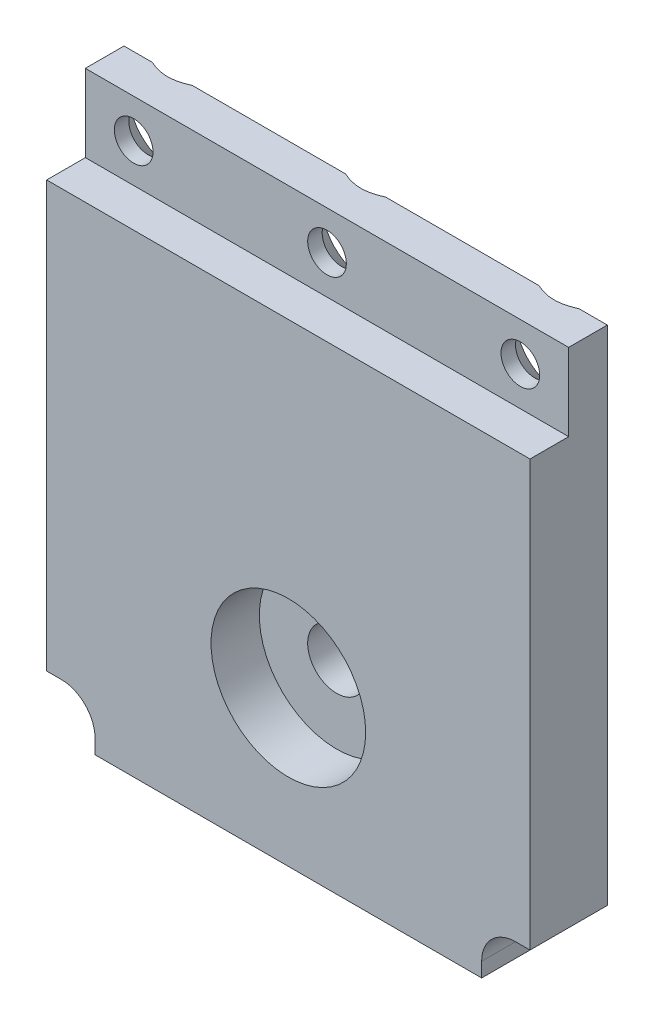
ISO-10303-21;
HEADER;
FILE_DESCRIPTION(('STEP AP214'),'2;1');
FILE_NAME('part.step','',(''),(''),'','','');
FILE_SCHEMA(('AUTOMOTIVE_DESIGN { 1 0 10303 214 1 1 1 1 }'));
ENDSEC;
DATA;
#1=APPLICATION_CONTEXT('core data for automotive mechanical design processes');
#2=APPLICATION_PROTOCOL_DEFINITION('international standard','automotive_design',2000,#1);
#3=PRODUCT_CONTEXT('',#1,'mechanical');
#4=PRODUCT('Part','Part','',(#3));
#5=PRODUCT_RELATED_PRODUCT_CATEGORY('part','',(#4));
#6=PRODUCT_DEFINITION_FORMATION('','',#4);
#7=PRODUCT_DEFINITION_CONTEXT('part definition',#1,'design');
#8=PRODUCT_DEFINITION('design','',#6,#7);
#9=PRODUCT_DEFINITION_SHAPE('','',#8);
#10=(LENGTH_UNIT() NAMED_UNIT(*) SI_UNIT(.MILLI.,.METRE.));
#11=(NAMED_UNIT(*) PLANE_ANGLE_UNIT() SI_UNIT($,.RADIAN.));
#12=(NAMED_UNIT(*) SI_UNIT($,.STERADIAN.) SOLID_ANGLE_UNIT());
#13=UNCERTAINTY_MEASURE_WITH_UNIT(LENGTH_MEASURE(1.E-05),#10,'distance_accuracy_value','');
#14=(GEOMETRIC_REPRESENTATION_CONTEXT(3) GLOBAL_UNCERTAINTY_ASSIGNED_CONTEXT((#13)) GLOBAL_UNIT_ASSIGNED_CONTEXT((#10,
#11,#12)) REPRESENTATION_CONTEXT('',''));
#15=CARTESIAN_POINT('',(0.,0.,0.));
#16=DIRECTION('',(0.,0.,1.));
#17=DIRECTION('',(1.,0.,0.));
#18=AXIS2_PLACEMENT_3D('',#15,#16,#17);
#19=CARTESIAN_POINT('',(-25.,28.5,8.));
#20=DIRECTION('',(0.,-1.,0.));
#21=DIRECTION('',(1.,0.,0.));
#22=AXIS2_PLACEMENT_3D('',#19,#20,#21);
#23=PLANE('',#22);
#24=DIRECTION('',(-1.,0.,0.));
#25=VECTOR('',#24,1.);
#26=CARTESIAN_POINT('',(-25.,28.5,4.));
#27=LINE('',#26,#25);
#28=CARTESIAN_POINT('',(25.,28.5,4.));
#29=VERTEX_POINT('',#28);
#30=CARTESIAN_POINT('',(-25.,28.5,4.));
#31=VERTEX_POINT('',#30);
#32=EDGE_CURVE('E158',#29,#31,#27,.T.);
#33=ORIENTED_EDGE('',*,*,#32,.F.);
#34=DIRECTION('',(0.,0.,-1.));
#35=VECTOR('',#34,1.);
#36=CARTESIAN_POINT('',(25.,28.5,8.));
#37=LINE('',#36,#35);
#38=CARTESIAN_POINT('',(25.,28.5,0.));
#39=VERTEX_POINT('',#38);
#40=EDGE_CURVE('E242',#29,#39,#37,.T.);
#41=ORIENTED_EDGE('',*,*,#40,.T.);
#42=DIRECTION('',(-1.,0.,0.));
#43=VECTOR('',#42,1.);
#44=CARTESIAN_POINT('',(-25.,28.5,0.));
#45=LINE('',#44,#43);
#46=CARTESIAN_POINT('',(22.0615528128088,28.5,0.));
#47=VERTEX_POINT('',#46);
#48=EDGE_CURVE('E206',#39,#47,#45,.T.);
#49=ORIENTED_EDGE('',*,*,#48,.T.);
#50=CARTESIAN_POINT('',(22.0615528128088,28.5,0.));
#51=CARTESIAN_POINT('',(21.9163115076665,28.5,0.0665140046887301));
#52=CARTESIAN_POINT('',(21.7687872339746,28.5,0.128569718966713));
#53=CARTESIAN_POINT('',(21.4687365346781,28.5,0.241160332854404));
#54=CARTESIAN_POINT('',(21.3161917571449,28.5,0.291645925575715));
#55=CARTESIAN_POINT('',(21.0088769190301,28.5,0.377331377129475));
#56=CARTESIAN_POINT('',(20.8541609144906,28.5,0.412719940976492));
#57=CARTESIAN_POINT('',(20.5419867211631,28.5,0.466367057856301));
#58=CARTESIAN_POINT('',(20.3845337208675,28.5,0.484655043680468));
#59=CARTESIAN_POINT('',(20.0809432550529,28.5,0.501824046995297));
#60=CARTESIAN_POINT('',(19.9348859756068,28.5,0.502113580668128));
#61=CARTESIAN_POINT('',(19.6435468990572,28.5,0.486786692782426));
#62=CARTESIAN_POINT('',(19.4982655528719,28.5,0.471161860054131));
#63=CARTESIAN_POINT('',(19.2100936986599,28.5,0.425237963374039));
#64=CARTESIAN_POINT('',(19.067203240881,28.5,0.394938591416323));
#65=CARTESIAN_POINT('',(18.7846957776989,28.5,0.321684210682046));
#66=CARTESIAN_POINT('',(18.6450801209539,28.5,0.278724083308546));
#67=CARTESIAN_POINT('',(18.410526573718,28.5,0.196723660111647));
#68=CARTESIAN_POINT('',(18.3146468065157,28.5,0.16031545116514));
#69=CARTESIAN_POINT('',(18.1250409435993,28.5,0.0832113414498181));
#70=CARTESIAN_POINT('',(18.0313081138786,28.5,0.042532050748546));
#71=CARTESIAN_POINT('',(17.9384471871911,28.5,0.));
#72=B_SPLINE_CURVE_WITH_KNOTS('',3,(#50,#51,#52,#53,#54,#55,#56,#57,#58,#59,#60,#61,#62,#63,#64,
#65,#66,#67,#68,#69,#70,#71),.UNSPECIFIED.,.F.,.F.,(4,2,2,2,2,2,2,2,2,2,4),(0.,
0.479497727555005,0.961002368999467,1.43629834305226,1.91077474381833,2.34806888838962,
2.78559427464543,3.2231288445797,3.66084054790949,3.968414012628,4.27483277985521),.UNSPECIFIED.);
#73=CARTESIAN_POINT('',(17.9384471871912,28.5,0.));
#74=VERTEX_POINT('',#73);
#75=EDGE_CURVE('E272',#47,#74,#72,.T.);
#76=ORIENTED_EDGE('',*,*,#75,.T.);
#77=CARTESIAN_POINT('',(2.06155281280885,28.5,0.));
#78=VERTEX_POINT('',#77);
#79=EDGE_CURVE('E240',#74,#78,#45,.T.);
#80=ORIENTED_EDGE('',*,*,#79,.T.);
#81=CARTESIAN_POINT('',(2.06155281280885,28.5,0.));
#82=CARTESIAN_POINT('',(1.91631150766653,28.5,0.0665140046887301));
#83=CARTESIAN_POINT('',(1.7687872339746,28.5,0.128569718966714));
#84=CARTESIAN_POINT('',(1.46873653467814,28.5,0.241160332854406));
#85=CARTESIAN_POINT('',(1.31619175714491,28.5,0.291645925575718));
#86=CARTESIAN_POINT('',(1.00887691903006,28.5,0.377331377129478));
#87=CARTESIAN_POINT('',(0.85416091449057,28.5,0.412719940976494));
#88=CARTESIAN_POINT('',(0.541986721163106,28.5,0.466367057856304));
#89=CARTESIAN_POINT('',(0.38453372086754,28.5,0.484655043680471));
#90=CARTESIAN_POINT('',(0.0809432550529437,28.5,0.501824046995299));
#91=CARTESIAN_POINT('',(-0.0651140243932302,28.5,0.50211358066813));
#92=CARTESIAN_POINT('',(-0.356453100942829,28.5,0.486786692782427));
#93=CARTESIAN_POINT('',(-0.501734447128126,28.5,0.471161860054132));
#94=CARTESIAN_POINT('',(-0.789906301340141,28.5,0.425237963374039));
#95=CARTESIAN_POINT('',(-0.932796759119046,28.5,0.394938591416322));
#96=CARTESIAN_POINT('',(-1.21530422230115,28.5,0.321684210682045));
#97=CARTESIAN_POINT('',(-1.35491987904607,28.5,0.278724083308545));
#98=CARTESIAN_POINT('',(-1.58947342628203,28.5,0.196723660111647));
#99=CARTESIAN_POINT('',(-1.68535319348432,28.5,0.160315451165141));
#100=CARTESIAN_POINT('',(-1.87495905640074,28.5,0.0832113414498207));
#101=CARTESIAN_POINT('',(-1.96869188612143,28.5,0.0425320507485486));
#102=CARTESIAN_POINT('',(-2.06155281280885,28.5,0.));
#103=B_SPLINE_CURVE_WITH_KNOTS('',3,(#81,#82,#83,#84,#85,#86,#87,#88,#89,#90,#91,#92,#93,#94,
#95,#96,#97,#98,#99,#100,#101,#102),.UNSPECIFIED.,.F.,.F.,(4,2,2,2,2,2,2,2,2,2,4),(0.,
0.479497727555007,0.961002368999472,1.43629834305227,1.91077474381835,2.34806888838963,
2.78559427464544,3.22312884457971,3.66084054790951,3.96841401262801,4.27483277985521),.UNSPECIFIED.);
#104=CARTESIAN_POINT('',(-2.06155281280885,28.5,0.));
#105=VERTEX_POINT('',#104);
#106=EDGE_CURVE('E292',#78,#105,#103,.T.);
#107=ORIENTED_EDGE('',*,*,#106,.T.);
#108=CARTESIAN_POINT('',(-17.9384471871911,28.5,0.));
#109=VERTEX_POINT('',#108);
#110=EDGE_CURVE('E378',#105,#109,#45,.T.);
#111=ORIENTED_EDGE('',*,*,#110,.T.);
#112=CARTESIAN_POINT('',(-17.9384471871911,28.5,0.));
#113=CARTESIAN_POINT('',(-18.0836884923335,28.5,0.0665140046887315));
#114=CARTESIAN_POINT('',(-18.2312127660254,28.5,0.128569718966716));
#115=CARTESIAN_POINT('',(-18.5312634653218,28.5,0.241160332854409));
#116=CARTESIAN_POINT('',(-18.6838082428551,28.5,0.291645925575721));
#117=CARTESIAN_POINT('',(-18.9911230809699,28.5,0.377331377129481));
#118=CARTESIAN_POINT('',(-19.1458390855094,28.5,0.412719940976498));
#119=CARTESIAN_POINT('',(-19.4580132788369,28.5,0.46636705785631));
#120=CARTESIAN_POINT('',(-19.6154662791325,28.5,0.484655043680477));
#121=CARTESIAN_POINT('',(-19.919056744947,28.5,0.501824046995306));
#122=CARTESIAN_POINT('',(-20.0651140243932,28.5,0.502113580668137));
#123=CARTESIAN_POINT('',(-20.3564531009428,28.5,0.486786692782435));
#124=CARTESIAN_POINT('',(-20.5017344471281,28.5,0.47116186005414));
#125=CARTESIAN_POINT('',(-20.7899063013401,28.5,0.425237963374048));
#126=CARTESIAN_POINT('',(-20.932796759119,28.5,0.394938591416331));
#127=CARTESIAN_POINT('',(-21.2153042223011,28.5,0.321684210682054));
#128=CARTESIAN_POINT('',(-21.3549198790461,28.5,0.278724083308555));
#129=CARTESIAN_POINT('',(-21.589473426282,28.5,0.196723660111654));
#130=CARTESIAN_POINT('',(-21.6853531934843,28.5,0.160315451165146));
#131=CARTESIAN_POINT('',(-21.8749590564008,28.5,0.0832113414498218));
#132=CARTESIAN_POINT('',(-21.9686918861214,28.5,0.0425320507485483));
#133=CARTESIAN_POINT('',(-22.0615528128089,28.5,0.));
#134=B_SPLINE_CURVE_WITH_KNOTS('',3,(#112,#113,#114,#115,#116,#117,#118,#119,#120,#121,#122,
#123,#124,#125,#126,#127,#128,#129,#130,#131,#132,#133),.UNSPECIFIED.,.F.,.F.,(4,2,2,2,2,2,2,2,
2,2,4),(0.,0.479497727555006,0.961002368999476,1.43629834305227,1.91077474381835,
2.34806888838963,2.78559427464545,3.22312884457971,3.66084054790951,3.96841401262803,
4.27483277985524),.UNSPECIFIED.);
#135=CARTESIAN_POINT('',(-22.0615528128089,28.5,0.));
#136=VERTEX_POINT('',#135);
#137=EDGE_CURVE('E265',#109,#136,#134,.T.);
#138=ORIENTED_EDGE('',*,*,#137,.T.);
#139=CARTESIAN_POINT('',(-25.,28.5,0.));
#140=VERTEX_POINT('',#139);
#141=EDGE_CURVE('E237',#136,#140,#45,.T.);
#142=ORIENTED_EDGE('',*,*,#141,.T.);
#143=DIRECTION('',(0.,0.,-1.));
#144=VECTOR('',#143,1.);
#145=CARTESIAN_POINT('',(-25.,28.5,8.));
#146=LINE('',#145,#144);
#147=EDGE_CURVE('E220',#31,#140,#146,.T.);
#148=ORIENTED_EDGE('',*,*,#147,.F.);
#149=EDGE_LOOP('',(#33,#41,#49,#76,#80,#107,#111,#138,#142,#148));
#150=FACE_BOUND('',#149,.T.);
#151=ADVANCED_FACE('F35',(#150),#23,.F.);
#152=CARTESIAN_POINT('',(-20.,24.5,0.));
#153=DIRECTION('',(0.,0.,1.));
#154=DIRECTION('',(1.,0.,0.));
#155=AXIS2_PLACEMENT_3D('',#152,#153,#154);
#156=CYLINDRICAL_SURFACE('',#155,2.);
#157=CARTESIAN_POINT('',(-20.,24.5,2.50000000000002));
#158=DIRECTION('',(0.,0.,1.));
#159=DIRECTION('',(1.,0.,0.));
#160=AXIS2_PLACEMENT_3D('',#157,#158,#159);
#161=CIRCLE('',#160,2.);
#162=CARTESIAN_POINT('',(-18.,24.5,2.50000000000002));
#163=VERTEX_POINT('',#162);
#164=EDGE_CURVE('E364',#163,#163,#161,.F.);
#165=ORIENTED_EDGE('',*,*,#164,.T.);
#166=EDGE_LOOP('',(#165));
#167=FACE_BOUND('',#166,.T.);
#168=CARTESIAN_POINT('',(-20.,24.5,4.));
#169=DIRECTION('',(0.,0.,1.));
#170=DIRECTION('',(1.,0.,0.));
#171=AXIS2_PLACEMENT_3D('',#168,#169,#170);
#172=CIRCLE('',#171,2.);
#173=CARTESIAN_POINT('',(-18.,24.5,4.));
#174=VERTEX_POINT('',#173);
#175=EDGE_CURVE('E176',#174,#174,#172,.F.);
#176=ORIENTED_EDGE('',*,*,#175,.F.);
#177=EDGE_LOOP('',(#176));
#178=FACE_BOUND('',#177,.T.);
#179=ADVANCED_FACE('F284',(#167,#178),#156,.F.);
#180=CARTESIAN_POINT('',(20.,24.5,0.));
#181=DIRECTION('',(0.,0.,1.));
#182=DIRECTION('',(1.,0.,0.));
#183=AXIS2_PLACEMENT_3D('',#180,#181,#182);
#184=CYLINDRICAL_SURFACE('',#183,2.00000000000001);
#185=CARTESIAN_POINT('',(20.,24.5,2.50000000000002));
#186=DIRECTION('',(0.,0.,1.));
#187=DIRECTION('',(1.,0.,0.));
#188=AXIS2_PLACEMENT_3D('',#185,#186,#187);
#189=CIRCLE('',#188,2.00000000000001);
#190=CARTESIAN_POINT('',(22.,24.5,2.50000000000002));
#191=VERTEX_POINT('',#190);
#192=EDGE_CURVE('E319',#191,#191,#189,.F.);
#193=ORIENTED_EDGE('',*,*,#192,.T.);
#194=EDGE_LOOP('',(#193));
#195=FACE_BOUND('',#194,.T.);
#196=CARTESIAN_POINT('',(20.,24.5,4.));
#197=DIRECTION('',(0.,0.,1.));
#198=DIRECTION('',(1.,0.,0.));
#199=AXIS2_PLACEMENT_3D('',#196,#197,#198);
#200=CIRCLE('',#199,2.00000000000001);
#201=CARTESIAN_POINT('',(22.,24.5,4.));
#202=VERTEX_POINT('',#201);
#203=EDGE_CURVE('E173',#202,#202,#200,.F.);
#204=ORIENTED_EDGE('',*,*,#203,.F.);
#205=EDGE_LOOP('',(#204));
#206=FACE_BOUND('',#205,.T.);
#207=ADVANCED_FACE('F427',(#195,#206),#184,.F.);
#208=CARTESIAN_POINT('',(0.,24.5,0.));
#209=DIRECTION('',(0.,0.,1.));
#210=DIRECTION('',(1.,0.,0.));
#211=AXIS2_PLACEMENT_3D('',#208,#209,#210);
#212=CYLINDRICAL_SURFACE('',#211,2.);
#213=CARTESIAN_POINT('',(0.,24.5,2.50000000000001));
#214=DIRECTION('',(0.,0.,1.));
#215=DIRECTION('',(1.,0.,0.));
#216=AXIS2_PLACEMENT_3D('',#213,#214,#215);
#217=CIRCLE('',#216,2.);
#218=CARTESIAN_POINT('',(2.,24.5,2.50000000000001));
#219=VERTEX_POINT('',#218);
#220=EDGE_CURVE('E298',#219,#219,#217,.F.);
#221=ORIENTED_EDGE('',*,*,#220,.T.);
#222=EDGE_LOOP('',(#221));
#223=FACE_BOUND('',#222,.T.);
#224=CARTESIAN_POINT('',(0.,24.5,4.));
#225=DIRECTION('',(0.,0.,1.));
#226=DIRECTION('',(1.,0.,0.));
#227=AXIS2_PLACEMENT_3D('',#224,#225,#226);
#228=CIRCLE('',#227,2.);
#229=CARTESIAN_POINT('',(2.,24.5,4.));
#230=VERTEX_POINT('',#229);
#231=EDGE_CURVE('E168',#230,#230,#228,.F.);
#232=ORIENTED_EDGE('',*,*,#231,.F.);
#233=EDGE_LOOP('',(#232));
#234=FACE_BOUND('',#233,.T.);
#235=ADVANCED_FACE('F373',(#223,#234),#212,.F.);
#236=CARTESIAN_POINT('',(-25.,28.5,8.));
#237=DIRECTION('',(1.,0.,0.));
#238=DIRECTION('',(0.,1.,0.));
#239=AXIS2_PLACEMENT_3D('',#236,#237,#238);
#240=PLANE('',#239);
#241=DIRECTION('',(0.,-1.,0.));
#242=VECTOR('',#241,1.);
#243=CARTESIAN_POINT('',(-25.,28.5,8.));
#244=LINE('',#243,#242);
#245=CARTESIAN_POINT('',(-25.,20.5,8.));
#246=VERTEX_POINT('',#245);
#247=CARTESIAN_POINT('',(-25.,-23.5,8.));
#248=VERTEX_POINT('',#247);
#249=EDGE_CURVE('E166',#246,#248,#244,.T.);
#250=ORIENTED_EDGE('',*,*,#249,.F.);
#251=DIRECTION('',(0.,0.,1.));
#252=VECTOR('',#251,1.);
#253=CARTESIAN_POINT('',(-25.,20.5,4.));
#254=LINE('',#253,#252);
#255=CARTESIAN_POINT('',(-25.,20.5,4.));
#256=VERTEX_POINT('',#255);
#257=EDGE_CURVE('E145',#256,#246,#254,.T.);
#258=ORIENTED_EDGE('',*,*,#257,.F.);
#259=DIRECTION('',(0.,-1.,0.));
#260=VECTOR('',#259,1.);
#261=CARTESIAN_POINT('',(-25.,28.5,4.));
#262=LINE('',#261,#260);
#263=EDGE_CURVE('E152',#31,#256,#262,.T.);
#264=ORIENTED_EDGE('',*,*,#263,.F.);
#265=ORIENTED_EDGE('',*,*,#147,.T.);
#266=DIRECTION('',(0.,-1.,0.));
#267=VECTOR('',#266,1.);
#268=CARTESIAN_POINT('',(-25.,28.5,0.));
#269=LINE('',#268,#267);
#270=CARTESIAN_POINT('',(-25.,-23.5,0.));
#271=VERTEX_POINT('',#270);
#272=EDGE_CURVE('E201',#140,#271,#269,.T.);
#273=ORIENTED_EDGE('',*,*,#272,.T.);
#274=DIRECTION('',(0.,0.,-1.));
#275=VECTOR('',#274,1.);
#276=CARTESIAN_POINT('',(-25.,-23.5,8.));
#277=LINE('',#276,#275);
#278=EDGE_CURVE('E253',#248,#271,#277,.T.);
#279=ORIENTED_EDGE('',*,*,#278,.F.);
#280=EDGE_LOOP('',(#250,#258,#264,#265,#273,#279));
#281=FACE_BOUND('',#280,.T.);
#282=ADVANCED_FACE('F164',(#281),#240,.F.);
#283=CARTESIAN_POINT('',(-25.,-23.5,8.));
#284=DIRECTION('',(0.,1.,0.));
#285=DIRECTION('',(-1.,0.,0.));
#286=AXIS2_PLACEMENT_3D('',#283,#284,#285);
#287=PLANE('',#286);
#288=DIRECTION('',(1.,0.,0.));
#289=VECTOR('',#288,1.);
#290=CARTESIAN_POINT('',(-25.,-23.5,0.));
#291=LINE('',#290,#289);
#292=CARTESIAN_POINT('',(-23.5,-23.5,0.));
#293=VERTEX_POINT('',#292);
#294=EDGE_CURVE('E223',#271,#293,#291,.T.);
#295=ORIENTED_EDGE('',*,*,#294,.T.);
#296=DIRECTION('',(0.,0.,-1.));
#297=VECTOR('',#296,1.);
#298=CARTESIAN_POINT('',(-23.5,-23.5,8.));
#299=LINE('',#298,#297);
#300=CARTESIAN_POINT('',(-23.5,-23.5,8.));
#301=VERTEX_POINT('',#300);
#302=EDGE_CURVE('E338',#293,#301,#299,.F.);
#303=ORIENTED_EDGE('',*,*,#302,.T.);
#304=DIRECTION('',(1.,0.,0.));
#305=VECTOR('',#304,1.);
#306=CARTESIAN_POINT('',(-25.,-23.5,8.));
#307=LINE('',#306,#305);
#308=EDGE_CURVE('E205',#248,#301,#307,.T.);
#309=ORIENTED_EDGE('',*,*,#308,.F.);
#310=ORIENTED_EDGE('',*,*,#278,.T.);
#311=EDGE_LOOP('',(#295,#303,#309,#310));
#312=FACE_BOUND('',#311,.T.);
#313=ADVANCED_FACE('F384',(#312),#287,.F.);
#314=CARTESIAN_POINT('',(-20.,-23.5,8.));
#315=DIRECTION('',(1.,0.,0.));
#316=DIRECTION('',(0.,0.,-1.));
#317=AXIS2_PLACEMENT_3D('',#314,#315,#316);
#318=PLANE('',#317);
#319=DIRECTION('',(0.,-1.,0.));
#320=VECTOR('',#319,1.);
#321=CARTESIAN_POINT('',(-20.,-23.5,8.));
#322=LINE('',#321,#320);
#323=CARTESIAN_POINT('',(-20.,-27.,8.));
#324=VERTEX_POINT('',#323);
#325=CARTESIAN_POINT('',(-20.,-28.5,8.));
#326=VERTEX_POINT('',#325);
#327=EDGE_CURVE('E209',#324,#326,#322,.T.);
#328=ORIENTED_EDGE('',*,*,#327,.F.);
#329=DIRECTION('',(0.,0.,-1.));
#330=VECTOR('',#329,1.);
#331=CARTESIAN_POINT('',(-20.,-27.,0.));
#332=LINE('',#331,#330);
#333=CARTESIAN_POINT('',(-20.,-27.,0.));
#334=VERTEX_POINT('',#333);
#335=EDGE_CURVE('E342',#324,#334,#332,.T.);
#336=ORIENTED_EDGE('',*,*,#335,.T.);
#337=DIRECTION('',(0.,-1.,0.));
#338=VECTOR('',#337,1.);
#339=CARTESIAN_POINT('',(-20.,-23.5,0.));
#340=LINE('',#339,#338);
#341=CARTESIAN_POINT('',(-20.,-28.5,0.));
#342=VERTEX_POINT('',#341);
#343=EDGE_CURVE('E226',#334,#342,#340,.T.);
#344=ORIENTED_EDGE('',*,*,#343,.T.);
#345=DIRECTION('',(0.,0.,-1.));
#346=VECTOR('',#345,1.);
#347=CARTESIAN_POINT('',(-20.,-28.5,8.));
#348=LINE('',#347,#346);
#349=EDGE_CURVE('E250',#326,#342,#348,.T.);
#350=ORIENTED_EDGE('',*,*,#349,.F.);
#351=EDGE_LOOP('',(#328,#336,#344,#350));
#352=FACE_BOUND('',#351,.T.);
#353=ADVANCED_FACE('F360',(#352),#318,.F.);
#354=CARTESIAN_POINT('',(-20.,-28.5,8.));
#355=DIRECTION('',(0.,1.,0.));
#356=DIRECTION('',(0.,0.,1.));
#357=AXIS2_PLACEMENT_3D('',#354,#355,#356);
#358=PLANE('',#357);
#359=CARTESIAN_POINT('',(15.,-28.5,4.));
#360=DIRECTION('',(0.,-1.,0.));
#361=DIRECTION('',(0.,0.,-1.));
#362=AXIS2_PLACEMENT_3D('',#359,#360,#361);
#363=CIRCLE('',#362,2.);
#364=CARTESIAN_POINT('',(15.,-28.5,2.));
#365=VERTEX_POINT('',#364);
#366=EDGE_CURVE('E189',#365,#365,#363,.T.);
#367=ORIENTED_EDGE('',*,*,#366,.F.);
#368=EDGE_LOOP('',(#367));
#369=FACE_BOUND('',#368,.T.);
#370=CARTESIAN_POINT('',(-15.,-28.5,4.));
#371=DIRECTION('',(0.,-1.,0.));
#372=DIRECTION('',(0.,0.,-1.));
#373=AXIS2_PLACEMENT_3D('',#370,#371,#372);
#374=CIRCLE('',#373,2.);
#375=CARTESIAN_POINT('',(-15.,-28.5,2.));
#376=VERTEX_POINT('',#375);
#377=EDGE_CURVE('E195',#376,#376,#374,.T.);
#378=ORIENTED_EDGE('',*,*,#377,.F.);
#379=EDGE_LOOP('',(#378));
#380=FACE_BOUND('',#379,.T.);
#381=DIRECTION('',(1.,0.,0.));
#382=VECTOR('',#381,1.);
#383=CARTESIAN_POINT('',(-20.,-28.5,0.));
#384=LINE('',#383,#382);
#385=CARTESIAN_POINT('',(20.,-28.5,0.));
#386=VERTEX_POINT('',#385);
#387=EDGE_CURVE('E228',#342,#386,#384,.T.);
#388=ORIENTED_EDGE('',*,*,#387,.T.);
#389=DIRECTION('',(0.,0.,-1.));
#390=VECTOR('',#389,1.);
#391=CARTESIAN_POINT('',(20.,-28.5,8.));
#392=LINE('',#391,#390);
#393=CARTESIAN_POINT('',(20.,-28.5,8.));
#394=VERTEX_POINT('',#393);
#395=EDGE_CURVE('E247',#394,#386,#392,.T.);
#396=ORIENTED_EDGE('',*,*,#395,.F.);
#397=DIRECTION('',(1.,0.,0.));
#398=VECTOR('',#397,1.);
#399=CARTESIAN_POINT('',(-20.,-28.5,8.));
#400=LINE('',#399,#398);
#401=EDGE_CURVE('E211',#326,#394,#400,.T.);
#402=ORIENTED_EDGE('',*,*,#401,.F.);
#403=ORIENTED_EDGE('',*,*,#349,.T.);
#404=EDGE_LOOP('',(#388,#396,#402,#403));
#405=FACE_BOUND('',#404,.T.);
#406=ADVANCED_FACE('F390',(#369,#380,#405),#358,.F.);
#407=CARTESIAN_POINT('',(20.,-23.5,8.));
#408=DIRECTION('',(-1.,0.,0.));
#409=DIRECTION('',(0.,0.,1.));
#410=AXIS2_PLACEMENT_3D('',#407,#408,#409);
#411=PLANE('',#410);
#412=DIRECTION('',(0.,1.,0.));
#413=VECTOR('',#412,1.);
#414=CARTESIAN_POINT('',(20.,-23.5,0.));
#415=LINE('',#414,#413);
#416=CARTESIAN_POINT('',(20.,-27.,0.));
#417=VERTEX_POINT('',#416);
#418=EDGE_CURVE('E230',#386,#417,#415,.T.);
#419=ORIENTED_EDGE('',*,*,#418,.T.);
#420=DIRECTION('',(0.,0.,-1.));
#421=VECTOR('',#420,1.);
#422=CARTESIAN_POINT('',(20.,-27.,8.));
#423=LINE('',#422,#421);
#424=CARTESIAN_POINT('',(20.,-27.,8.));
#425=VERTEX_POINT('',#424);
#426=EDGE_CURVE('E50',#417,#425,#423,.F.);
#427=ORIENTED_EDGE('',*,*,#426,.T.);
#428=DIRECTION('',(0.,1.,0.));
#429=VECTOR('',#428,1.);
#430=CARTESIAN_POINT('',(20.,-23.5,8.));
#431=LINE('',#430,#429);
#432=EDGE_CURVE('E213',#394,#425,#431,.T.);
#433=ORIENTED_EDGE('',*,*,#432,.F.);
#434=ORIENTED_EDGE('',*,*,#395,.T.);
#435=EDGE_LOOP('',(#419,#427,#433,#434));
#436=FACE_BOUND('',#435,.T.);
#437=ADVANCED_FACE('F395',(#436),#411,.F.);
#438=CARTESIAN_POINT('',(25.,-23.5,8.));
#439=DIRECTION('',(0.,1.,0.));
#440=DIRECTION('',(0.,0.,1.));
#441=AXIS2_PLACEMENT_3D('',#438,#439,#440);
#442=PLANE('',#441);
#443=DIRECTION('',(1.,0.,0.));
#444=VECTOR('',#443,1.);
#445=CARTESIAN_POINT('',(25.,-23.5,8.));
#446=LINE('',#445,#444);
#447=CARTESIAN_POINT('',(23.5,-23.5,8.));
#448=VERTEX_POINT('',#447);
#449=CARTESIAN_POINT('',(25.,-23.5,8.));
#450=VERTEX_POINT('',#449);
#451=EDGE_CURVE('E215',#448,#450,#446,.T.);
#452=ORIENTED_EDGE('',*,*,#451,.F.);
#453=DIRECTION('',(0.,0.,-1.));
#454=VECTOR('',#453,1.);
#455=CARTESIAN_POINT('',(23.5,-23.5,0.));
#456=LINE('',#455,#454);
#457=CARTESIAN_POINT('',(23.5,-23.5,0.));
#458=VERTEX_POINT('',#457);
#459=EDGE_CURVE('E335',#448,#458,#456,.T.);
#460=ORIENTED_EDGE('',*,*,#459,.T.);
#461=DIRECTION('',(1.,0.,0.));
#462=VECTOR('',#461,1.);
#463=CARTESIAN_POINT('',(25.,-23.5,0.));
#464=LINE('',#463,#462);
#465=CARTESIAN_POINT('',(25.,-23.5,0.));
#466=VERTEX_POINT('',#465);
#467=EDGE_CURVE('E232',#458,#466,#464,.T.);
#468=ORIENTED_EDGE('',*,*,#467,.T.);
#469=DIRECTION('',(0.,0.,-1.));
#470=VECTOR('',#469,1.);
#471=CARTESIAN_POINT('',(25.,-23.5,8.));
#472=LINE('',#471,#470);
#473=EDGE_CURVE('E244',#450,#466,#472,.T.);
#474=ORIENTED_EDGE('',*,*,#473,.F.);
#475=EDGE_LOOP('',(#452,#460,#468,#474));
#476=FACE_BOUND('',#475,.T.);
#477=ADVANCED_FACE('F333',(#476),#442,.F.);
#478=CARTESIAN_POINT('',(25.,28.5,8.));
#479=DIRECTION('',(-1.,0.,0.));
#480=DIRECTION('',(0.,0.,1.));
#481=AXIS2_PLACEMENT_3D('',#478,#479,#480);
#482=PLANE('',#481);
#483=DIRECTION('',(0.,1.,0.));
#484=VECTOR('',#483,1.);
#485=CARTESIAN_POINT('',(25.,20.5,4.));
#486=LINE('',#485,#484);
#487=CARTESIAN_POINT('',(25.,20.5,4.));
#488=VERTEX_POINT('',#487);
#489=EDGE_CURVE('E151',#488,#29,#486,.T.);
#490=ORIENTED_EDGE('',*,*,#489,.F.);
#491=DIRECTION('',(0.,0.,1.));
#492=VECTOR('',#491,1.);
#493=CARTESIAN_POINT('',(25.,20.5,4.));
#494=LINE('',#493,#492);
#495=CARTESIAN_POINT('',(25.,20.5,8.));
#496=VERTEX_POINT('',#495);
#497=EDGE_CURVE('E148',#488,#496,#494,.T.);
#498=ORIENTED_EDGE('',*,*,#497,.T.);
#499=DIRECTION('',(0.,1.,0.));
#500=VECTOR('',#499,1.);
#501=CARTESIAN_POINT('',(25.,28.5,8.));
#502=LINE('',#501,#500);
#503=EDGE_CURVE('E217',#450,#496,#502,.T.);
#504=ORIENTED_EDGE('',*,*,#503,.F.);
#505=ORIENTED_EDGE('',*,*,#473,.T.);
#506=DIRECTION('',(0.,1.,0.));
#507=VECTOR('',#506,1.);
#508=CARTESIAN_POINT('',(25.,28.5,0.));
#509=LINE('',#508,#507);
#510=EDGE_CURVE('E234',#466,#39,#509,.T.);
#511=ORIENTED_EDGE('',*,*,#510,.T.);
#512=ORIENTED_EDGE('',*,*,#40,.F.);
#513=EDGE_LOOP('',(#490,#498,#504,#505,#511,#512));
#514=FACE_BOUND('',#513,.T.);
#515=ADVANCED_FACE('F288',(#514),#482,.F.);
#516=CARTESIAN_POINT('',(0.,0.,8.));
#517=DIRECTION('',(0.,0.,1.));
#518=DIRECTION('',(1.,0.,0.));
#519=AXIS2_PLACEMENT_3D('',#516,#517,#518);
#520=PLANE('',#519);
#521=DIRECTION('',(1.,0.,0.));
#522=VECTOR('',#521,1.);
#523=CARTESIAN_POINT('',(-25.,20.5,8.));
#524=LINE('',#523,#522);
#525=EDGE_CURVE('E161',#246,#496,#524,.T.);
#526=ORIENTED_EDGE('',*,*,#525,.F.);
#527=ORIENTED_EDGE('',*,*,#249,.T.);
#528=ORIENTED_EDGE('',*,*,#308,.T.);
#529=CARTESIAN_POINT('',(-23.5,-27.,8.));
#530=DIRECTION('',(0.,0.,1.));
#531=DIRECTION('',(1.,0.,0.));
#532=AXIS2_PLACEMENT_3D('',#529,#530,#531);
#533=CIRCLE('',#532,3.5);
#534=EDGE_CURVE('E347',#301,#324,#533,.F.);
#535=ORIENTED_EDGE('',*,*,#534,.T.);
#536=ORIENTED_EDGE('',*,*,#327,.T.);
#537=ORIENTED_EDGE('',*,*,#401,.T.);
#538=ORIENTED_EDGE('',*,*,#432,.T.);
#539=CARTESIAN_POINT('',(23.5,-27.,8.));
#540=DIRECTION('',(0.,0.,1.));
#541=DIRECTION('',(1.,0.,0.));
#542=AXIS2_PLACEMENT_3D('',#539,#540,#541);
#543=CIRCLE('',#542,3.5);
#544=EDGE_CURVE('E12',#425,#448,#543,.F.);
#545=ORIENTED_EDGE('',*,*,#544,.T.);
#546=ORIENTED_EDGE('',*,*,#451,.T.);
#547=ORIENTED_EDGE('',*,*,#503,.T.);
#548=EDGE_LOOP('',(#526,#527,#528,#535,#536,#537,#538,#545,#546,#547));
#549=FACE_BOUND('',#548,.T.);
#550=CARTESIAN_POINT('',(0.,-12.5,8.));
#551=DIRECTION('',(0.,0.,1.));
#552=DIRECTION('',(1.,0.,0.));
#553=AXIS2_PLACEMENT_3D('',#550,#551,#552);
#554=CIRCLE('',#553,8.);
#555=CARTESIAN_POINT('',(8.,-12.5,8.));
#556=VERTEX_POINT('',#555);
#557=EDGE_CURVE('E185',#556,#556,#554,.T.);
#558=ORIENTED_EDGE('',*,*,#557,.F.);
#559=EDGE_LOOP('',(#558));
#560=FACE_BOUND('',#559,.T.);
#561=ADVANCED_FACE('F351',(#549,#560),#520,.T.);
#562=CARTESIAN_POINT('',(0.,0.,0.));
#563=DIRECTION('',(0.,0.,1.));
#564=DIRECTION('',(1.,0.,0.));
#565=AXIS2_PLACEMENT_3D('',#562,#563,#564);
#566=PLANE('',#565);
#567=CARTESIAN_POINT('',(0.,-12.5,0.));
#568=DIRECTION('',(0.,0.,1.));
#569=DIRECTION('',(1.,0.,0.));
#570=AXIS2_PLACEMENT_3D('',#567,#568,#569);
#571=CIRCLE('',#570,3.);
#572=CARTESIAN_POINT('',(3.,-12.5,0.));
#573=VERTEX_POINT('',#572);
#574=EDGE_CURVE('E182',#573,#573,#571,.T.);
#575=ORIENTED_EDGE('',*,*,#574,.T.);
#576=EDGE_LOOP('',(#575));
#577=FACE_BOUND('',#576,.T.);
#578=ORIENTED_EDGE('',*,*,#110,.F.);
#579=CARTESIAN_POINT('',(0.,24.5,0.));
#580=DIRECTION('',(0.,0.,1.));
#581=DIRECTION('',(1.,0.,0.));
#582=AXIS2_PLACEMENT_3D('',#579,#580,#581);
#583=CIRCLE('',#582,4.5);
#584=EDGE_CURVE('E262',#105,#78,#583,.T.);
#585=ORIENTED_EDGE('',*,*,#584,.T.);
#586=ORIENTED_EDGE('',*,*,#79,.F.);
#587=CARTESIAN_POINT('',(20.,24.5,0.));
#588=DIRECTION('',(0.,0.,1.));
#589=DIRECTION('',(1.,0.,0.));
#590=AXIS2_PLACEMENT_3D('',#587,#588,#589);
#591=CIRCLE('',#590,4.50000000000001);
#592=EDGE_CURVE('E259',#74,#47,#591,.T.);
#593=ORIENTED_EDGE('',*,*,#592,.T.);
#594=ORIENTED_EDGE('',*,*,#48,.F.);
#595=ORIENTED_EDGE('',*,*,#510,.F.);
#596=ORIENTED_EDGE('',*,*,#467,.F.);
#597=CARTESIAN_POINT('',(23.5,-27.,0.));
#598=DIRECTION('',(0.,0.,1.));
#599=DIRECTION('',(1.,0.,0.));
#600=AXIS2_PLACEMENT_3D('',#597,#598,#599);
#601=CIRCLE('',#600,3.5);
#602=EDGE_CURVE('E43',#458,#417,#601,.T.);
#603=ORIENTED_EDGE('',*,*,#602,.T.);
#604=ORIENTED_EDGE('',*,*,#418,.F.);
#605=ORIENTED_EDGE('',*,*,#387,.F.);
#606=ORIENTED_EDGE('',*,*,#343,.F.);
#607=CARTESIAN_POINT('',(-23.5,-27.,0.));
#608=DIRECTION('',(0.,0.,1.));
#609=DIRECTION('',(1.,0.,0.));
#610=AXIS2_PLACEMENT_3D('',#607,#608,#609);
#611=CIRCLE('',#610,3.5);
#612=EDGE_CURVE('E340',#334,#293,#611,.T.);
#613=ORIENTED_EDGE('',*,*,#612,.T.);
#614=ORIENTED_EDGE('',*,*,#294,.F.);
#615=ORIENTED_EDGE('',*,*,#272,.F.);
#616=ORIENTED_EDGE('',*,*,#141,.F.);
#617=CARTESIAN_POINT('',(-20.,24.5,0.));
#618=DIRECTION('',(0.,0.,1.));
#619=DIRECTION('',(1.,0.,0.));
#620=AXIS2_PLACEMENT_3D('',#617,#618,#619);
#621=CIRCLE('',#620,4.5);
#622=EDGE_CURVE('E256',#136,#109,#621,.T.);
#623=ORIENTED_EDGE('',*,*,#622,.T.);
#624=EDGE_LOOP('',(#578,#585,#586,#593,#594,#595,#596,#603,#604,#605,#606,#613,#614,#615,#616,#623));
#625=FACE_BOUND('',#624,.T.);
#626=ADVANCED_FACE('F286',(#577,#625),#566,.F.);
#627=CARTESIAN_POINT('',(-15.,-18.5,4.));
#628=DIRECTION('',(0.,-1.,0.));
#629=DIRECTION('',(0.,0.,-1.));
#630=AXIS2_PLACEMENT_3D('',#627,#628,#629);
#631=CYLINDRICAL_SURFACE('',#630,2.);
#632=CARTESIAN_POINT('',(-15.,-18.5,4.));
#633=DIRECTION('',(0.,-1.,0.));
#634=DIRECTION('',(0.,0.,-1.));
#635=AXIS2_PLACEMENT_3D('',#632,#633,#634);
#636=CIRCLE('',#635,2.);
#637=CARTESIAN_POINT('',(-15.,-18.5,2.));
#638=VERTEX_POINT('',#637);
#639=EDGE_CURVE('E198',#638,#638,#636,.T.);
#640=ORIENTED_EDGE('',*,*,#639,.F.);
#641=EDGE_LOOP('',(#640));
#642=FACE_BOUND('',#641,.T.);
#643=ORIENTED_EDGE('',*,*,#377,.T.);
#644=EDGE_LOOP('',(#643));
#645=FACE_BOUND('',#644,.T.);
#646=ADVANCED_FACE('F408',(#642,#645),#631,.F.);
#647=CARTESIAN_POINT('',(-15.,-18.5,4.));
#648=DIRECTION('',(0.,-1.,0.));
#649=DIRECTION('',(0.,0.,-1.));
#650=AXIS2_PLACEMENT_3D('',#647,#648,#649);
#651=PLANE('',#650);
#652=ORIENTED_EDGE('',*,*,#639,.T.);
#653=EDGE_LOOP('',(#652));
#654=FACE_BOUND('',#653,.T.);
#655=ADVANCED_FACE('F413',(#654),#651,.T.);
#656=CARTESIAN_POINT('',(15.,-18.5,4.));
#657=DIRECTION('',(0.,-1.,0.));
#658=DIRECTION('',(0.,0.,-1.));
#659=AXIS2_PLACEMENT_3D('',#656,#657,#658);
#660=CYLINDRICAL_SURFACE('',#659,2.);
#661=CARTESIAN_POINT('',(15.,-18.5,4.));
#662=DIRECTION('',(0.,-1.,0.));
#663=DIRECTION('',(0.,0.,-1.));
#664=AXIS2_PLACEMENT_3D('',#661,#662,#663);
#665=CIRCLE('',#664,2.);
#666=CARTESIAN_POINT('',(15.,-18.5,2.));
#667=VERTEX_POINT('',#666);
#668=EDGE_CURVE('E192',#667,#667,#665,.T.);
#669=ORIENTED_EDGE('',*,*,#668,.F.);
#670=EDGE_LOOP('',(#669));
#671=FACE_BOUND('',#670,.T.);
#672=ORIENTED_EDGE('',*,*,#366,.T.);
#673=EDGE_LOOP('',(#672));
#674=FACE_BOUND('',#673,.T.);
#675=ADVANCED_FACE('F417',(#671,#674),#660,.F.);
#676=CARTESIAN_POINT('',(15.,-18.5,4.));
#677=DIRECTION('',(0.,-1.,0.));
#678=DIRECTION('',(0.,0.,-1.));
#679=AXIS2_PLACEMENT_3D('',#676,#677,#678);
#680=PLANE('',#679);
#681=ORIENTED_EDGE('',*,*,#668,.T.);
#682=EDGE_LOOP('',(#681));
#683=FACE_BOUND('',#682,.T.);
#684=ADVANCED_FACE('F305',(#683),#680,.T.);
#685=CARTESIAN_POINT('',(0.,24.5,0.));
#686=DIRECTION('',(0.,0.,-1.));
#687=DIRECTION('',(-1.,0.,0.));
#688=AXIS2_PLACEMENT_3D('',#685,#686,#687);
#689=CONICAL_SURFACE('',#688,4.5,0.785398163397447);
#690=ORIENTED_EDGE('',*,*,#220,.F.);
#691=EDGE_LOOP('',(#690));
#692=FACE_BOUND('',#691,.T.);
#693=ORIENTED_EDGE('',*,*,#106,.F.);
#694=ORIENTED_EDGE('',*,*,#584,.F.);
#695=EDGE_LOOP('',(#693,#694));
#696=FACE_BOUND('',#695,.T.);
#697=ADVANCED_FACE('F300',(#692,#696),#689,.F.);
#698=CARTESIAN_POINT('',(20.,24.5,0.));
#699=DIRECTION('',(0.,0.,-1.));
#700=DIRECTION('',(-1.,0.,0.));
#701=AXIS2_PLACEMENT_3D('',#698,#699,#700);
#702=CONICAL_SURFACE('',#701,4.50000000000001,0.785398163397445);
#703=ORIENTED_EDGE('',*,*,#192,.F.);
#704=EDGE_LOOP('',(#703));
#705=FACE_BOUND('',#704,.T.);
#706=ORIENTED_EDGE('',*,*,#75,.F.);
#707=ORIENTED_EDGE('',*,*,#592,.F.);
#708=EDGE_LOOP('',(#706,#707));
#709=FACE_BOUND('',#708,.T.);
#710=ADVANCED_FACE('F304',(#705,#709),#702,.F.);
#711=CARTESIAN_POINT('',(-20.,24.5,0.));
#712=DIRECTION('',(0.,0.,-1.));
#713=DIRECTION('',(-1.,0.,0.));
#714=AXIS2_PLACEMENT_3D('',#711,#712,#713);
#715=CONICAL_SURFACE('',#714,4.5,0.785398163397445);
#716=ORIENTED_EDGE('',*,*,#164,.F.);
#717=EDGE_LOOP('',(#716));
#718=FACE_BOUND('',#717,.T.);
#719=ORIENTED_EDGE('',*,*,#137,.F.);
#720=ORIENTED_EDGE('',*,*,#622,.F.);
#721=EDGE_LOOP('',(#719,#720));
#722=FACE_BOUND('',#721,.T.);
#723=ADVANCED_FACE('F278',(#718,#722),#715,.F.);
#724=CARTESIAN_POINT('',(0.,-12.5,3.));
#725=DIRECTION('',(0.,0.,1.));
#726=DIRECTION('',(1.,0.,0.));
#727=AXIS2_PLACEMENT_3D('',#724,#725,#726);
#728=CYLINDRICAL_SURFACE('',#727,8.);
#729=CARTESIAN_POINT('',(0.,-12.5,3.));
#730=DIRECTION('',(0.,0.,1.));
#731=DIRECTION('',(1.,0.,0.));
#732=AXIS2_PLACEMENT_3D('',#729,#730,#731);
#733=CIRCLE('',#732,8.);
#734=CARTESIAN_POINT('',(8.,-12.5,3.));
#735=VERTEX_POINT('',#734);
#736=EDGE_CURVE('E186',#735,#735,#733,.T.);
#737=ORIENTED_EDGE('',*,*,#736,.F.);
#738=EDGE_LOOP('',(#737));
#739=FACE_BOUND('',#738,.T.);
#740=ORIENTED_EDGE('',*,*,#557,.T.);
#741=EDGE_LOOP('',(#740));
#742=FACE_BOUND('',#741,.T.);
#743=ADVANCED_FACE('F314',(#739,#742),#728,.F.);
#744=CARTESIAN_POINT('',(0.,-12.5,3.));
#745=DIRECTION('',(0.,0.,1.));
#746=DIRECTION('',(1.,0.,0.));
#747=AXIS2_PLACEMENT_3D('',#744,#745,#746);
#748=PLANE('',#747);
#749=CARTESIAN_POINT('',(0.,-12.5,3.));
#750=DIRECTION('',(0.,0.,1.));
#751=DIRECTION('',(1.,0.,0.));
#752=AXIS2_PLACEMENT_3D('',#749,#750,#751);
#753=CIRCLE('',#752,3.);
#754=CARTESIAN_POINT('',(3.,-12.5,3.));
#755=VERTEX_POINT('',#754);
#756=EDGE_CURVE('E179',#755,#755,#753,.T.);
#757=ORIENTED_EDGE('',*,*,#756,.F.);
#758=EDGE_LOOP('',(#757));
#759=FACE_BOUND('',#758,.T.);
#760=ORIENTED_EDGE('',*,*,#736,.T.);
#761=EDGE_LOOP('',(#760));
#762=FACE_BOUND('',#761,.T.);
#763=ADVANCED_FACE('F435',(#759,#762),#748,.T.);
#764=CARTESIAN_POINT('',(0.,-12.5,-0.389204906403618));
#765=DIRECTION('',(0.,0.,1.));
#766=DIRECTION('',(1.,0.,0.));
#767=AXIS2_PLACEMENT_3D('',#764,#765,#766);
#768=CYLINDRICAL_SURFACE('',#767,3.);
#769=ORIENTED_EDGE('',*,*,#756,.T.);
#770=EDGE_LOOP('',(#769));
#771=FACE_BOUND('',#770,.T.);
#772=ORIENTED_EDGE('',*,*,#574,.F.);
#773=EDGE_LOOP('',(#772));
#774=FACE_BOUND('',#773,.T.);
#775=ADVANCED_FACE('F439',(#771,#774),#768,.F.);
#776=CARTESIAN_POINT('',(0.,0.,4.));
#777=DIRECTION('',(0.,0.,1.));
#778=DIRECTION('',(1.,0.,0.));
#779=AXIS2_PLACEMENT_3D('',#776,#777,#778);
#780=PLANE('',#779);
#781=ORIENTED_EDGE('',*,*,#263,.T.);
#782=DIRECTION('',(1.,0.,0.));
#783=VECTOR('',#782,1.);
#784=CARTESIAN_POINT('',(-25.,20.5,4.));
#785=LINE('',#784,#783);
#786=EDGE_CURVE('E141',#256,#488,#785,.T.);
#787=ORIENTED_EDGE('',*,*,#786,.T.);
#788=ORIENTED_EDGE('',*,*,#489,.T.);
#789=ORIENTED_EDGE('',*,*,#32,.T.);
#790=EDGE_LOOP('',(#781,#787,#788,#789));
#791=FACE_BOUND('',#790,.T.);
#792=ORIENTED_EDGE('',*,*,#231,.T.);
#793=EDGE_LOOP('',(#792));
#794=FACE_BOUND('',#793,.T.);
#795=ORIENTED_EDGE('',*,*,#203,.T.);
#796=EDGE_LOOP('',(#795));
#797=FACE_BOUND('',#796,.T.);
#798=ORIENTED_EDGE('',*,*,#175,.T.);
#799=EDGE_LOOP('',(#798));
#800=FACE_BOUND('',#799,.T.);
#801=ADVANCED_FACE('F155',(#791,#794,#797,#800),#780,.T.);
#802=CARTESIAN_POINT('',(-25.,20.5,4.));
#803=DIRECTION('',(0.,-1.,0.));
#804=DIRECTION('',(0.,0.,-1.));
#805=AXIS2_PLACEMENT_3D('',#802,#803,#804);
#806=PLANE('',#805);
#807=ORIENTED_EDGE('',*,*,#525,.T.);
#808=ORIENTED_EDGE('',*,*,#497,.F.);
#809=ORIENTED_EDGE('',*,*,#786,.F.);
#810=ORIENTED_EDGE('',*,*,#257,.T.);
#811=EDGE_LOOP('',(#807,#808,#809,#810));
#812=FACE_BOUND('',#811,.T.);
#813=ADVANCED_FACE('F143',(#812),#806,.F.);
#814=CARTESIAN_POINT('',(-23.5,-27.,8.));
#815=DIRECTION('',(0.,0.,1.));
#816=DIRECTION('',(1.,0.,0.));
#817=AXIS2_PLACEMENT_3D('',#814,#815,#816);
#818=CYLINDRICAL_SURFACE('',#817,3.5);
#819=ORIENTED_EDGE('',*,*,#534,.F.);
#820=ORIENTED_EDGE('',*,*,#302,.F.);
#821=ORIENTED_EDGE('',*,*,#612,.F.);
#822=ORIENTED_EDGE('',*,*,#335,.F.);
#823=EDGE_LOOP('',(#819,#820,#821,#822));
#824=FACE_BOUND('',#823,.T.);
#825=ADVANCED_FACE('F363',(#824),#818,.F.);
#826=CARTESIAN_POINT('',(23.5,-27.,8.));
#827=DIRECTION('',(0.,0.,1.));
#828=DIRECTION('',(1.,0.,0.));
#829=AXIS2_PLACEMENT_3D('',#826,#827,#828);
#830=CYLINDRICAL_SURFACE('',#829,3.5);
#831=ORIENTED_EDGE('',*,*,#544,.F.);
#832=ORIENTED_EDGE('',*,*,#426,.F.);
#833=ORIENTED_EDGE('',*,*,#602,.F.);
#834=ORIENTED_EDGE('',*,*,#459,.F.);
#835=EDGE_LOOP('',(#831,#832,#833,#834));
#836=FACE_BOUND('',#835,.T.);
#837=ADVANCED_FACE('F37',(#836),#830,.F.);
#838=CLOSED_SHELL('',(#151,#179,#207,#235,#282,#313,#353,#406,#437,#477,#515,#561,#626,#646,
#655,#675,#684,#697,#710,#723,#743,#763,#775,#801,#813,#825,#837));
#839=MANIFOLD_SOLID_BREP('B2',#838);
#840=ADVANCED_BREP_SHAPE_REPRESENTATION('',(#18,#839),#14);
#841=SHAPE_DEFINITION_REPRESENTATION(#9,#840);
ENDSEC;
END-ISO-10303-21;
